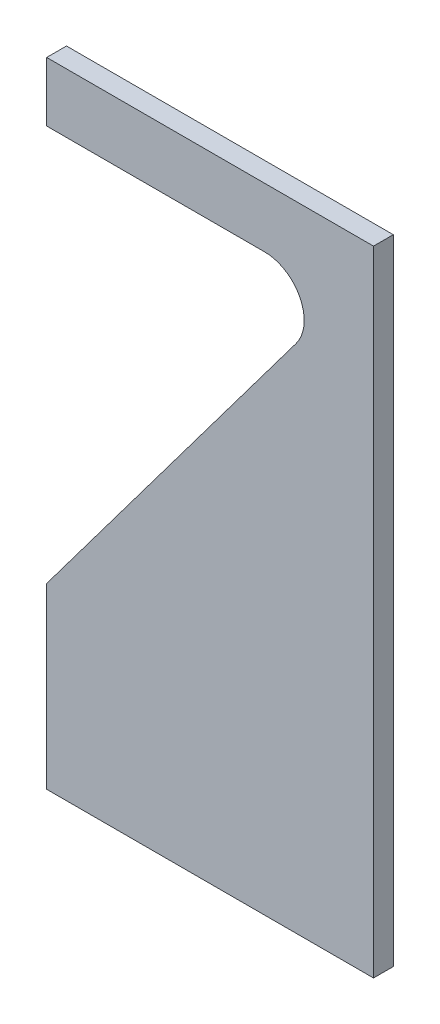
ISO-10303-21;
HEADER;
FILE_DESCRIPTION(('STEP AP214'),'2;1');
FILE_NAME('part.step','',(''),(''),'','','');
FILE_SCHEMA(('AUTOMOTIVE_DESIGN { 1 0 10303 214 1 1 1 1 }'));
ENDSEC;
DATA;
#1=APPLICATION_CONTEXT('core data for automotive mechanical design processes');
#2=APPLICATION_PROTOCOL_DEFINITION('international standard','automotive_design',2000,#1);
#3=PRODUCT_CONTEXT('',#1,'mechanical');
#4=PRODUCT('Part','Part','',(#3));
#5=PRODUCT_RELATED_PRODUCT_CATEGORY('part','',(#4));
#6=PRODUCT_DEFINITION_FORMATION('','',#4);
#7=PRODUCT_DEFINITION_CONTEXT('part definition',#1,'design');
#8=PRODUCT_DEFINITION('design','',#6,#7);
#9=PRODUCT_DEFINITION_SHAPE('','',#8);
#10=(LENGTH_UNIT() NAMED_UNIT(*) SI_UNIT(.MILLI.,.METRE.));
#11=(NAMED_UNIT(*) PLANE_ANGLE_UNIT() SI_UNIT($,.RADIAN.));
#12=(NAMED_UNIT(*) SI_UNIT($,.STERADIAN.) SOLID_ANGLE_UNIT());
#13=UNCERTAINTY_MEASURE_WITH_UNIT(LENGTH_MEASURE(1.E-05),#10,'distance_accuracy_value','');
#14=(GEOMETRIC_REPRESENTATION_CONTEXT(3) GLOBAL_UNCERTAINTY_ASSIGNED_CONTEXT((#13)) GLOBAL_UNIT_ASSIGNED_CONTEXT((#10,
#11,#12)) REPRESENTATION_CONTEXT('',''));
#15=CARTESIAN_POINT('',(0.,0.,0.));
#16=DIRECTION('',(0.,0.,1.));
#17=DIRECTION('',(1.,0.,0.));
#18=AXIS2_PLACEMENT_3D('',#15,#16,#17);
#19=CARTESIAN_POINT('',(0.,0.,10.));
#20=DIRECTION('',(0.,-1.,0.));
#21=DIRECTION('',(1.,0.,0.));
#22=AXIS2_PLACEMENT_3D('',#19,#20,#21);
#23=PLANE('',#22);
#24=DIRECTION('',(-1.,0.,0.));
#25=VECTOR('',#24,1.);
#26=CARTESIAN_POINT('',(0.,0.,0.));
#27=LINE('',#26,#25);
#28=CARTESIAN_POINT('',(0.,0.,0.));
#29=VERTEX_POINT('',#28);
#30=CARTESIAN_POINT('',(-165.,0.,0.));
#31=VERTEX_POINT('',#30);
#32=EDGE_CURVE('E140',#29,#31,#27,.T.);
#33=ORIENTED_EDGE('',*,*,#32,.T.);
#34=DIRECTION('',(0.,0.,-1.));
#35=VECTOR('',#34,1.);
#36=CARTESIAN_POINT('',(-165.,0.,10.));
#37=LINE('',#36,#35);
#38=CARTESIAN_POINT('',(-165.,0.,10.));
#39=VERTEX_POINT('',#38);
#40=EDGE_CURVE('E11',#39,#31,#37,.T.);
#41=ORIENTED_EDGE('',*,*,#40,.F.);
#42=DIRECTION('',(-1.,0.,0.));
#43=VECTOR('',#42,1.);
#44=CARTESIAN_POINT('',(0.,0.,10.));
#45=LINE('',#44,#43);
#46=CARTESIAN_POINT('',(0.,0.,10.));
#47=VERTEX_POINT('',#46);
#48=EDGE_CURVE('E162',#47,#39,#45,.T.);
#49=ORIENTED_EDGE('',*,*,#48,.F.);
#50=DIRECTION('',(0.,0.,-1.));
#51=VECTOR('',#50,1.);
#52=CARTESIAN_POINT('',(0.,0.,10.));
#53=LINE('',#52,#51);
#54=EDGE_CURVE('E136',#47,#29,#53,.T.);
#55=ORIENTED_EDGE('',*,*,#54,.T.);
#56=EDGE_LOOP('',(#33,#41,#49,#55));
#57=FACE_BOUND('',#56,.T.);
#58=ADVANCED_FACE('F39',(#57),#23,.F.);
#59=CARTESIAN_POINT('',(-165.,0.,10.));
#60=DIRECTION('',(1.,0.,0.));
#61=DIRECTION('',(0.,0.,-1.));
#62=AXIS2_PLACEMENT_3D('',#59,#60,#61);
#63=PLANE('',#62);
#64=DIRECTION('',(0.,-1.,0.));
#65=VECTOR('',#64,1.);
#66=CARTESIAN_POINT('',(-165.,0.,0.));
#67=LINE('',#66,#65);
#68=CARTESIAN_POINT('',(-165.,-30.,0.));
#69=VERTEX_POINT('',#68);
#70=EDGE_CURVE('E144',#31,#69,#67,.T.);
#71=ORIENTED_EDGE('',*,*,#70,.T.);
#72=DIRECTION('',(0.,0.,-1.));
#73=VECTOR('',#72,1.);
#74=CARTESIAN_POINT('',(-165.,-30.,10.));
#75=LINE('',#74,#73);
#76=CARTESIAN_POINT('',(-165.,-30.,10.));
#77=VERTEX_POINT('',#76);
#78=EDGE_CURVE('E48',#77,#69,#75,.T.);
#79=ORIENTED_EDGE('',*,*,#78,.F.);
#80=DIRECTION('',(0.,-1.,0.));
#81=VECTOR('',#80,1.);
#82=CARTESIAN_POINT('',(-165.,0.,10.));
#83=LINE('',#82,#81);
#84=EDGE_CURVE('E99',#39,#77,#83,.T.);
#85=ORIENTED_EDGE('',*,*,#84,.F.);
#86=ORIENTED_EDGE('',*,*,#40,.T.);
#87=EDGE_LOOP('',(#71,#79,#85,#86));
#88=FACE_BOUND('',#87,.T.);
#89=ADVANCED_FACE('F208',(#88),#63,.F.);
#90=CARTESIAN_POINT('',(-165.,-30.,10.));
#91=DIRECTION('',(0.,1.,0.));
#92=DIRECTION('',(0.,0.,1.));
#93=AXIS2_PLACEMENT_3D('',#90,#91,#92);
#94=PLANE('',#93);
#95=DIRECTION('',(1.,0.,0.));
#96=VECTOR('',#95,1.);
#97=CARTESIAN_POINT('',(-165.,-30.,0.));
#98=LINE('',#97,#96);
#99=CARTESIAN_POINT('',(-54.9995310649421,-30.,0.));
#100=VERTEX_POINT('',#99);
#101=EDGE_CURVE('E147',#69,#100,#98,.T.);
#102=ORIENTED_EDGE('',*,*,#101,.T.);
#103=DIRECTION('',(0.,0.,-1.));
#104=VECTOR('',#103,1.);
#105=CARTESIAN_POINT('',(-54.9995310649421,-30.,10.));
#106=LINE('',#105,#104);
#107=CARTESIAN_POINT('',(-54.9995310649421,-30.,10.));
#108=VERTEX_POINT('',#107);
#109=EDGE_CURVE('E173',#108,#100,#106,.T.);
#110=ORIENTED_EDGE('',*,*,#109,.F.);
#111=DIRECTION('',(1.,0.,0.));
#112=VECTOR('',#111,1.);
#113=CARTESIAN_POINT('',(-165.,-30.,10.));
#114=LINE('',#113,#112);
#115=EDGE_CURVE('E183',#77,#108,#114,.T.);
#116=ORIENTED_EDGE('',*,*,#115,.F.);
#117=ORIENTED_EDGE('',*,*,#78,.T.);
#118=EDGE_LOOP('',(#102,#110,#116,#117));
#119=FACE_BOUND('',#118,.T.);
#120=ADVANCED_FACE('F181',(#119),#94,.F.);
#121=CARTESIAN_POINT('',(-54.9995310649421,-50.,10.));
#122=DIRECTION('',(0.,0.,-1.));
#123=DIRECTION('',(-1.,0.,0.));
#124=AXIS2_PLACEMENT_3D('',#121,#122,#123);
#125=CYLINDRICAL_SURFACE('',#124,20.);
#126=CARTESIAN_POINT('',(-54.9995310649421,-50.,0.));
#127=DIRECTION('',(0.,0.,-1.));
#128=DIRECTION('',(1.,0.,0.));
#129=AXIS2_PLACEMENT_3D('',#126,#127,#128);
#130=CIRCLE('',#129,20.);
#131=CARTESIAN_POINT('',(-38.999552501972,-62.0000285826533,0.));
#132=VERTEX_POINT('',#131);
#133=EDGE_CURVE('E150',#100,#132,#130,.T.);
#134=ORIENTED_EDGE('',*,*,#133,.T.);
#135=DIRECTION('',(0.,0.,-1.));
#136=VECTOR('',#135,1.);
#137=CARTESIAN_POINT('',(-38.999552501972,-62.0000285826533,10.));
#138=LINE('',#137,#136);
#139=CARTESIAN_POINT('',(-38.999552501972,-62.0000285826533,10.));
#140=VERTEX_POINT('',#139);
#141=EDGE_CURVE('E169',#140,#132,#138,.T.);
#142=ORIENTED_EDGE('',*,*,#141,.F.);
#143=CARTESIAN_POINT('',(-54.9995310649421,-50.,10.));
#144=DIRECTION('',(0.,0.,-1.));
#145=DIRECTION('',(1.,0.,0.));
#146=AXIS2_PLACEMENT_3D('',#143,#144,#145);
#147=CIRCLE('',#146,20.);
#148=EDGE_CURVE('E196',#108,#140,#147,.T.);
#149=ORIENTED_EDGE('',*,*,#148,.F.);
#150=ORIENTED_EDGE('',*,*,#109,.T.);
#151=EDGE_LOOP('',(#134,#142,#149,#150));
#152=FACE_BOUND('',#151,.T.);
#153=ADVANCED_FACE('F191',(#152),#125,.F.);
#154=CARTESIAN_POINT('',(-38.999552501972,-62.0000285826533,10.));
#155=DIRECTION('',(0.799998928148508,-0.600001429132664,0.));
#156=DIRECTION('',(0.600001429132664,0.799998928148508,0.));
#157=AXIS2_PLACEMENT_3D('',#154,#155,#156);
#158=PLANE('',#157);
#159=DIRECTION('',(-0.600001429132664,-0.799998928148507,0.));
#160=VECTOR('',#159,1.);
#161=CARTESIAN_POINT('',(-38.999552501972,-62.0000285826533,0.));
#162=LINE('',#161,#160);
#163=CARTESIAN_POINT('',(-165.,-230.,0.));
#164=VERTEX_POINT('',#163);
#165=EDGE_CURVE('E153',#132,#164,#162,.T.);
#166=ORIENTED_EDGE('',*,*,#165,.T.);
#167=DIRECTION('',(0.,0.,-1.));
#168=VECTOR('',#167,1.);
#169=CARTESIAN_POINT('',(-165.,-230.,10.));
#170=LINE('',#169,#168);
#171=CARTESIAN_POINT('',(-165.,-230.,10.));
#172=VERTEX_POINT('',#171);
#173=EDGE_CURVE('E129',#172,#164,#170,.T.);
#174=ORIENTED_EDGE('',*,*,#173,.F.);
#175=DIRECTION('',(-0.600001429132664,-0.799998928148507,0.));
#176=VECTOR('',#175,1.);
#177=CARTESIAN_POINT('',(-38.999552501972,-62.0000285826533,10.));
#178=LINE('',#177,#176);
#179=EDGE_CURVE('E118',#140,#172,#178,.T.);
#180=ORIENTED_EDGE('',*,*,#179,.F.);
#181=ORIENTED_EDGE('',*,*,#141,.T.);
#182=EDGE_LOOP('',(#166,#174,#180,#181));
#183=FACE_BOUND('',#182,.T.);
#184=ADVANCED_FACE('F194',(#183),#158,.F.);
#185=CARTESIAN_POINT('',(-165.,-230.,10.));
#186=DIRECTION('',(1.,0.,0.));
#187=DIRECTION('',(0.,0.,-1.));
#188=AXIS2_PLACEMENT_3D('',#185,#186,#187);
#189=PLANE('',#188);
#190=DIRECTION('',(0.,-1.,0.));
#191=VECTOR('',#190,1.);
#192=CARTESIAN_POINT('',(-165.,-230.,0.));
#193=LINE('',#192,#191);
#194=CARTESIAN_POINT('',(-165.,-320.,0.));
#195=VERTEX_POINT('',#194);
#196=EDGE_CURVE('E127',#164,#195,#193,.T.);
#197=ORIENTED_EDGE('',*,*,#196,.T.);
#198=DIRECTION('',(0.,0.,-1.));
#199=VECTOR('',#198,1.);
#200=CARTESIAN_POINT('',(-165.,-320.,10.));
#201=LINE('',#200,#199);
#202=CARTESIAN_POINT('',(-165.,-320.,10.));
#203=VERTEX_POINT('',#202);
#204=EDGE_CURVE('E124',#203,#195,#201,.T.);
#205=ORIENTED_EDGE('',*,*,#204,.F.);
#206=DIRECTION('',(0.,-1.,0.));
#207=VECTOR('',#206,1.);
#208=CARTESIAN_POINT('',(-165.,-230.,10.));
#209=LINE('',#208,#207);
#210=EDGE_CURVE('E112',#172,#203,#209,.T.);
#211=ORIENTED_EDGE('',*,*,#210,.F.);
#212=ORIENTED_EDGE('',*,*,#173,.T.);
#213=EDGE_LOOP('',(#197,#205,#211,#212));
#214=FACE_BOUND('',#213,.T.);
#215=ADVANCED_FACE('F125',(#214),#189,.F.);
#216=CARTESIAN_POINT('',(-165.,-320.,10.));
#217=DIRECTION('',(0.,1.,0.));
#218=DIRECTION('',(0.,0.,1.));
#219=AXIS2_PLACEMENT_3D('',#216,#217,#218);
#220=PLANE('',#219);
#221=DIRECTION('',(1.,0.,0.));
#222=VECTOR('',#221,1.);
#223=CARTESIAN_POINT('',(-165.,-320.,0.));
#224=LINE('',#223,#222);
#225=CARTESIAN_POINT('',(0.,-320.,0.));
#226=VERTEX_POINT('',#225);
#227=EDGE_CURVE('E85',#195,#226,#224,.T.);
#228=ORIENTED_EDGE('',*,*,#227,.T.);
#229=DIRECTION('',(0.,0.,-1.));
#230=VECTOR('',#229,1.);
#231=CARTESIAN_POINT('',(0.,-320.,10.));
#232=LINE('',#231,#230);
#233=CARTESIAN_POINT('',(0.,-320.,10.));
#234=VERTEX_POINT('',#233);
#235=EDGE_CURVE('E130',#234,#226,#232,.T.);
#236=ORIENTED_EDGE('',*,*,#235,.F.);
#237=DIRECTION('',(1.,0.,0.));
#238=VECTOR('',#237,1.);
#239=CARTESIAN_POINT('',(-165.,-320.,10.));
#240=LINE('',#239,#238);
#241=EDGE_CURVE('E116',#203,#234,#240,.T.);
#242=ORIENTED_EDGE('',*,*,#241,.F.);
#243=ORIENTED_EDGE('',*,*,#204,.T.);
#244=EDGE_LOOP('',(#228,#236,#242,#243));
#245=FACE_BOUND('',#244,.T.);
#246=ADVANCED_FACE('F132',(#245),#220,.F.);
#247=CARTESIAN_POINT('',(0.,0.,10.));
#248=DIRECTION('',(-1.,0.,0.));
#249=DIRECTION('',(0.,0.,1.));
#250=AXIS2_PLACEMENT_3D('',#247,#248,#249);
#251=PLANE('',#250);
#252=DIRECTION('',(0.,1.,0.));
#253=VECTOR('',#252,1.);
#254=CARTESIAN_POINT('',(0.,0.,0.));
#255=LINE('',#254,#253);
#256=EDGE_CURVE('E91',#226,#29,#255,.T.);
#257=ORIENTED_EDGE('',*,*,#256,.T.);
#258=ORIENTED_EDGE('',*,*,#54,.F.);
#259=DIRECTION('',(0.,1.,0.));
#260=VECTOR('',#259,1.);
#261=CARTESIAN_POINT('',(0.,0.,10.));
#262=LINE('',#261,#260);
#263=EDGE_CURVE('E56',#234,#47,#262,.T.);
#264=ORIENTED_EDGE('',*,*,#263,.F.);
#265=ORIENTED_EDGE('',*,*,#235,.T.);
#266=EDGE_LOOP('',(#257,#258,#264,#265));
#267=FACE_BOUND('',#266,.T.);
#268=ADVANCED_FACE('F224',(#267),#251,.F.);
#269=CARTESIAN_POINT('',(-54.9995310649421,-50.,10.));
#270=DIRECTION('',(0.,0.,1.));
#271=DIRECTION('',(1.,0.,0.));
#272=AXIS2_PLACEMENT_3D('',#269,#270,#271);
#273=PLANE('',#272);
#274=ORIENTED_EDGE('',*,*,#48,.T.);
#275=ORIENTED_EDGE('',*,*,#84,.T.);
#276=ORIENTED_EDGE('',*,*,#115,.T.);
#277=ORIENTED_EDGE('',*,*,#148,.T.);
#278=ORIENTED_EDGE('',*,*,#179,.T.);
#279=ORIENTED_EDGE('',*,*,#210,.T.);
#280=ORIENTED_EDGE('',*,*,#241,.T.);
#281=ORIENTED_EDGE('',*,*,#263,.T.);
#282=EDGE_LOOP('',(#274,#275,#276,#277,#278,#279,#280,#281));
#283=FACE_BOUND('',#282,.T.);
#284=ADVANCED_FACE('F114',(#283),#273,.T.);
#285=CARTESIAN_POINT('',(-54.9995310649421,-50.,0.));
#286=DIRECTION('',(0.,0.,1.));
#287=DIRECTION('',(1.,0.,0.));
#288=AXIS2_PLACEMENT_3D('',#285,#286,#287);
#289=PLANE('',#288);
#290=ORIENTED_EDGE('',*,*,#32,.F.);
#291=ORIENTED_EDGE('',*,*,#256,.F.);
#292=ORIENTED_EDGE('',*,*,#227,.F.);
#293=ORIENTED_EDGE('',*,*,#196,.F.);
#294=ORIENTED_EDGE('',*,*,#165,.F.);
#295=ORIENTED_EDGE('',*,*,#133,.F.);
#296=ORIENTED_EDGE('',*,*,#101,.F.);
#297=ORIENTED_EDGE('',*,*,#70,.F.);
#298=EDGE_LOOP('',(#290,#291,#292,#293,#294,#295,#296,#297));
#299=FACE_BOUND('',#298,.T.);
#300=ADVANCED_FACE('F187',(#299),#289,.F.);
#301=CLOSED_SHELL('',(#58,#89,#120,#153,#184,#215,#246,#268,#284,#300));
#302=MANIFOLD_SOLID_BREP('B2',#301);
#303=ADVANCED_BREP_SHAPE_REPRESENTATION('',(#18,#302),#14);
#304=SHAPE_DEFINITION_REPRESENTATION(#9,#303);
ENDSEC;
END-ISO-10303-21;
